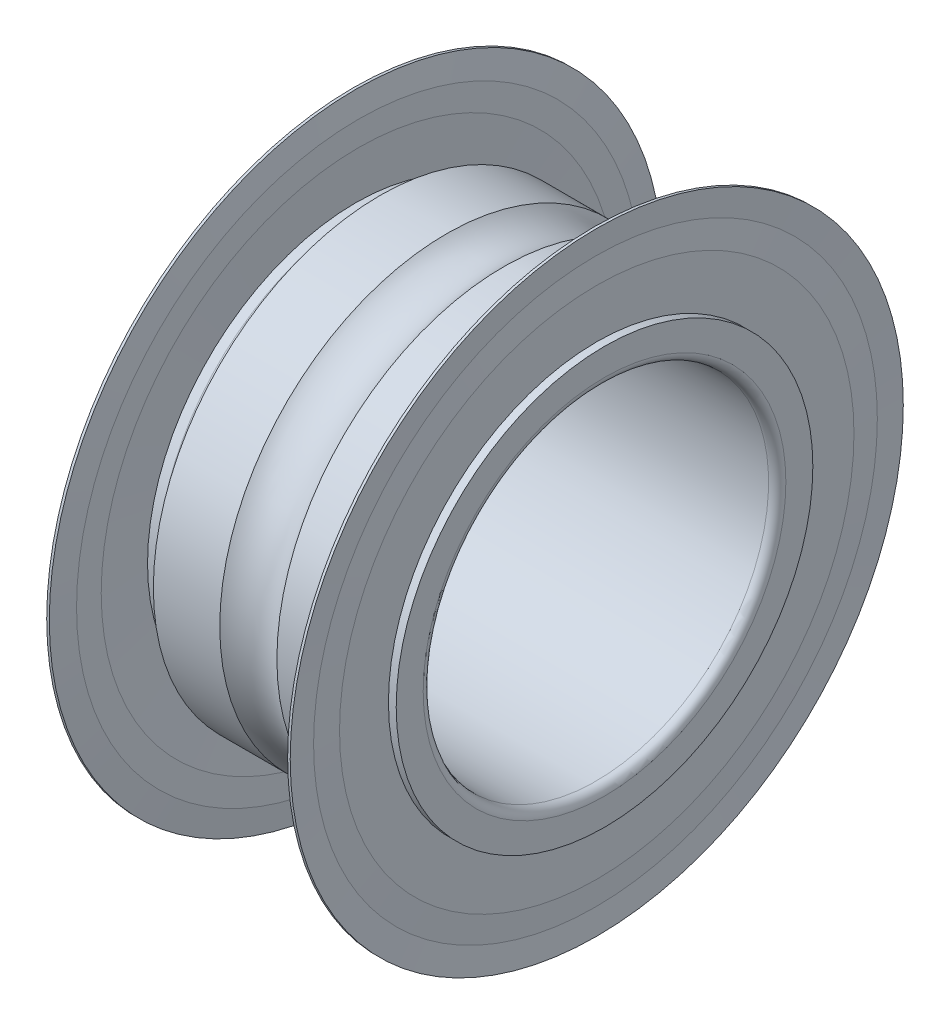
ISO-10303-21;
HEADER;
FILE_DESCRIPTION(('STEP AP214'),'2;1');
FILE_NAME('part.step','',(''),(''),'','','');
FILE_SCHEMA(('AUTOMOTIVE_DESIGN { 1 0 10303 214 1 1 1 1 }'));
ENDSEC;
DATA;
#1=APPLICATION_CONTEXT('core data for automotive mechanical design processes');
#2=APPLICATION_PROTOCOL_DEFINITION('international standard','automotive_design',2000,#1);
#3=PRODUCT_CONTEXT('',#1,'mechanical');
#4=PRODUCT('Part','Part','',(#3));
#5=PRODUCT_RELATED_PRODUCT_CATEGORY('part','',(#4));
#6=PRODUCT_DEFINITION_FORMATION('','',#4);
#7=PRODUCT_DEFINITION_CONTEXT('part definition',#1,'design');
#8=PRODUCT_DEFINITION('design','',#6,#7);
#9=PRODUCT_DEFINITION_SHAPE('','',#8);
#10=(LENGTH_UNIT() NAMED_UNIT(*) SI_UNIT(.MILLI.,.METRE.));
#11=(NAMED_UNIT(*) PLANE_ANGLE_UNIT() SI_UNIT($,.RADIAN.));
#12=(NAMED_UNIT(*) SI_UNIT($,.STERADIAN.) SOLID_ANGLE_UNIT());
#13=UNCERTAINTY_MEASURE_WITH_UNIT(LENGTH_MEASURE(1.E-05),#10,'distance_accuracy_value','');
#14=(GEOMETRIC_REPRESENTATION_CONTEXT(3) GLOBAL_UNCERTAINTY_ASSIGNED_CONTEXT((#13)) GLOBAL_UNIT_ASSIGNED_CONTEXT((#10,
#11,#12)) REPRESENTATION_CONTEXT('',''));
#15=CARTESIAN_POINT('',(0.,0.,0.));
#16=DIRECTION('',(0.,0.,1.));
#17=DIRECTION('',(1.,0.,0.));
#18=AXIS2_PLACEMENT_3D('',#15,#16,#17);
#19=CARTESIAN_POINT('',(0.,-4.825,-4.825));
#20=DIRECTION('',(-1.,0.,0.));
#21=DIRECTION('',(0.,0.,1.));
#22=AXIS2_PLACEMENT_3D('',#19,#20,#21);
#23=PLANE('',#22);
#24=CARTESIAN_POINT('',(0.,0.,0.));
#25=DIRECTION('',(-1.,0.,0.));
#26=DIRECTION('',(0.,0.,-1.));
#27=AXIS2_PLACEMENT_3D('',#24,#25,#26);
#28=CIRCLE('',#27,4.825);
#29=CARTESIAN_POINT('',(0.,0.,-4.825));
#30=VERTEX_POINT('',#29);
#31=EDGE_CURVE('E109',#30,#30,#28,.F.);
#32=ORIENTED_EDGE('',*,*,#31,.F.);
#33=EDGE_LOOP('',(#32));
#34=FACE_BOUND('',#33,.T.);
#35=CARTESIAN_POINT('',(0.,0.,0.));
#36=DIRECTION('',(1.,0.,0.));
#37=DIRECTION('',(0.,0.,1.));
#38=AXIS2_PLACEMENT_3D('',#35,#36,#37);
#39=CIRCLE('',#38,4.2);
#40=CARTESIAN_POINT('',(0.,0.,4.2));
#41=VERTEX_POINT('',#40);
#42=EDGE_CURVE('E106',#41,#41,#39,.T.);
#43=ORIENTED_EDGE('',*,*,#42,.T.);
#44=EDGE_LOOP('',(#43));
#45=FACE_BOUND('',#44,.T.);
#46=ADVANCED_FACE('F14',(#34,#45),#23,.T.);
#47=CARTESIAN_POINT('',(6.,-4.8249997657901,4.82500037109325));
#48=DIRECTION('',(1.,0.,0.));
#49=DIRECTION('',(0.,0.,-1.));
#50=AXIS2_PLACEMENT_3D('',#47,#48,#49);
#51=PLANE('',#50);
#52=CARTESIAN_POINT('',(6.,0.,0.));
#53=DIRECTION('',(1.,0.,0.));
#54=DIRECTION('',(0.,-1.42310903832655E-07,0.99999999999999));
#55=AXIS2_PLACEMENT_3D('',#52,#53,#54);
#56=CIRCLE('',#55,4.825);
#57=CARTESIAN_POINT('',(6.,-6.86650110992563E-07,4.82499999999995));
#58=VERTEX_POINT('',#57);
#59=EDGE_CURVE('E103',#58,#58,#56,.T.);
#60=ORIENTED_EDGE('',*,*,#59,.T.);
#61=EDGE_LOOP('',(#60));
#62=FACE_BOUND('',#61,.T.);
#63=CARTESIAN_POINT('',(6.,0.,0.));
#64=DIRECTION('',(-1.,0.,0.));
#65=DIRECTION('',(0.,0.,-1.));
#66=AXIS2_PLACEMENT_3D('',#63,#64,#65);
#67=CIRCLE('',#66,4.20000011099115);
#68=CARTESIAN_POINT('',(6.,0.,-4.20000011099115));
#69=VERTEX_POINT('',#68);
#70=EDGE_CURVE('E100',#69,#69,#67,.F.);
#71=ORIENTED_EDGE('',*,*,#70,.F.);
#72=EDGE_LOOP('',(#71));
#73=FACE_BOUND('',#72,.T.);
#74=ADVANCED_FACE('F117',(#62,#73),#51,.T.);
#75=CARTESIAN_POINT('',(0.8,-5.32082048514981,5.25000017536941));
#76=DIRECTION('',(-1.,0.,0.));
#77=DIRECTION('',(0.,1.,0.));
#78=AXIS2_PLACEMENT_3D('',#75,#76,#77);
#79=PLANE('',#78);
#80=CARTESIAN_POINT('',(0.8,0.,0.));
#81=DIRECTION('',(-1.,0.,0.));
#82=DIRECTION('',(0.,0.,-1.));
#83=AXIS2_PLACEMENT_3D('',#80,#81,#82);
#84=CIRCLE('',#83,5.25);
#85=CARTESIAN_POINT('',(0.8,0.,-5.25));
#86=VERTEX_POINT('',#85);
#87=EDGE_CURVE('E97',#86,#86,#84,.T.);
#88=ORIENTED_EDGE('',*,*,#87,.T.);
#89=EDGE_LOOP('',(#88));
#90=FACE_BOUND('',#89,.T.);
#91=CARTESIAN_POINT('',(0.8,0.,0.));
#92=DIRECTION('',(1.,0.,0.));
#93=DIRECTION('',(0.,0.,1.));
#94=AXIS2_PLACEMENT_3D('',#91,#92,#93);
#95=CIRCLE('',#94,5.15833335866041);
#96=CARTESIAN_POINT('',(0.8,0.,5.15833335866041));
#97=VERTEX_POINT('',#96);
#98=EDGE_CURVE('E94',#97,#97,#95,.T.);
#99=ORIENTED_EDGE('',*,*,#98,.T.);
#100=EDGE_LOOP('',(#99));
#101=FACE_BOUND('',#100,.T.);
#102=ADVANCED_FACE('F392',(#90,#101),#79,.T.);
#103=CARTESIAN_POINT('',(5.2,-5.32082048514981,-5.25000017536941));
#104=DIRECTION('',(1.,0.,0.));
#105=DIRECTION('',(0.,1.,0.));
#106=AXIS2_PLACEMENT_3D('',#103,#104,#105);
#107=PLANE('',#106);
#108=CARTESIAN_POINT('',(5.2,0.,0.));
#109=DIRECTION('',(1.,0.,0.));
#110=DIRECTION('',(0.,0.,1.));
#111=AXIS2_PLACEMENT_3D('',#108,#109,#110);
#112=CIRCLE('',#111,5.25);
#113=CARTESIAN_POINT('',(5.2,0.,5.25));
#114=VERTEX_POINT('',#113);
#115=EDGE_CURVE('E91',#114,#114,#112,.T.);
#116=ORIENTED_EDGE('',*,*,#115,.T.);
#117=EDGE_LOOP('',(#116));
#118=FACE_BOUND('',#117,.T.);
#119=CARTESIAN_POINT('',(5.2,0.,0.));
#120=DIRECTION('',(-1.,0.,0.));
#121=DIRECTION('',(0.,0.,-1.));
#122=AXIS2_PLACEMENT_3D('',#119,#120,#121);
#123=CIRCLE('',#122,5.15833336552346);
#124=CARTESIAN_POINT('',(5.2,0.,-5.15833336552346));
#125=VERTEX_POINT('',#124);
#126=EDGE_CURVE('E88',#125,#125,#123,.F.);
#127=ORIENTED_EDGE('',*,*,#126,.F.);
#128=EDGE_LOOP('',(#127));
#129=FACE_BOUND('',#128,.T.);
#130=ADVANCED_FACE('F382',(#118,#129),#107,.T.);
#131=CARTESIAN_POINT('',(0.18,-6.12028247775235,-5.9575));
#132=DIRECTION('',(-1.,0.,0.));
#133=DIRECTION('',(0.,0.,1.));
#134=AXIS2_PLACEMENT_3D('',#131,#132,#133);
#135=PLANE('',#134);
#136=CARTESIAN_POINT('',(0.18,0.,0.));
#137=DIRECTION('',(-1.,0.,0.));
#138=DIRECTION('',(0.,0.,-1.));
#139=AXIS2_PLACEMENT_3D('',#136,#137,#138);
#140=CIRCLE('',#139,5.95750000000004);
#141=CARTESIAN_POINT('',(0.18,0.,-5.95750000000004));
#142=VERTEX_POINT('',#141);
#143=EDGE_CURVE('E85',#142,#142,#140,.F.);
#144=ORIENTED_EDGE('',*,*,#143,.F.);
#145=EDGE_LOOP('',(#144));
#146=FACE_BOUND('',#145,.T.);
#147=CARTESIAN_POINT('',(0.18,0.,0.));
#148=DIRECTION('',(1.,0.,0.));
#149=DIRECTION('',(0.,-1.42053889480427E-07,0.99999999999999));
#150=AXIS2_PLACEMENT_3D('',#147,#148,#149);
#151=CIRCLE('',#150,4.825);
#152=CARTESIAN_POINT('',(0.18,-6.85410016743059E-07,4.82499999999995));
#153=VERTEX_POINT('',#152);
#154=EDGE_CURVE('E82',#153,#153,#151,.F.);
#155=ORIENTED_EDGE('',*,*,#154,.F.);
#156=EDGE_LOOP('',(#155));
#157=FACE_BOUND('',#156,.T.);
#158=ADVANCED_FACE('F372',(#146,#157),#135,.T.);
#159=CARTESIAN_POINT('',(0.3,-6.70714127742983,6.52875));
#160=DIRECTION('',(1.,0.,0.));
#161=DIRECTION('',(0.,0.,-1.));
#162=AXIS2_PLACEMENT_3D('',#159,#160,#161);
#163=PLANE('',#162);
#164=CARTESIAN_POINT('',(0.3,0.,0.));
#165=DIRECTION('',(1.,0.,0.));
#166=DIRECTION('',(0.,-1.16853194638104E-09,1.));
#167=AXIS2_PLACEMENT_3D('',#164,#165,#166);
#168=CIRCLE('',#167,6.52875);
#169=CARTESIAN_POINT('',(0.3,-7.62905294493521E-09,6.52875));
#170=VERTEX_POINT('',#169);
#171=EDGE_CURVE('E79',#170,#170,#168,.T.);
#172=ORIENTED_EDGE('',*,*,#171,.T.);
#173=EDGE_LOOP('',(#172));
#174=FACE_BOUND('',#173,.T.);
#175=CARTESIAN_POINT('',(0.3,0.,0.));
#176=DIRECTION('',(-1.,0.,0.));
#177=DIRECTION('',(0.,0.,-1.));
#178=AXIS2_PLACEMENT_3D('',#175,#176,#177);
#179=CIRCLE('',#178,5.95749999999997);
#180=CARTESIAN_POINT('',(0.3,0.,-5.95749999999997));
#181=VERTEX_POINT('',#180);
#182=EDGE_CURVE('E76',#181,#181,#179,.F.);
#183=ORIENTED_EDGE('',*,*,#182,.F.);
#184=EDGE_LOOP('',(#183));
#185=FACE_BOUND('',#184,.T.);
#186=ADVANCED_FACE('F362',(#174,#185),#163,.T.);
#187=CARTESIAN_POINT('',(5.7,-6.70714128856494,-6.52875));
#188=DIRECTION('',(-1.,0.,0.));
#189=DIRECTION('',(0.,0.,1.));
#190=AXIS2_PLACEMENT_3D('',#187,#188,#189);
#191=PLANE('',#190);
#192=CARTESIAN_POINT('',(5.7,0.,0.));
#193=DIRECTION('',(-1.,0.,0.));
#194=DIRECTION('',(0.,0.,-1.));
#195=AXIS2_PLACEMENT_3D('',#192,#193,#194);
#196=CIRCLE('',#195,6.52875000000004);
#197=CARTESIAN_POINT('',(5.7,0.,-6.52875000000004));
#198=VERTEX_POINT('',#197);
#199=EDGE_CURVE('E73',#198,#198,#196,.F.);
#200=ORIENTED_EDGE('',*,*,#199,.F.);
#201=EDGE_LOOP('',(#200));
#202=FACE_BOUND('',#201,.T.);
#203=CARTESIAN_POINT('',(5.7,0.,0.));
#204=DIRECTION('',(1.,0.,0.));
#205=DIRECTION('',(0.,0.,1.));
#206=AXIS2_PLACEMENT_3D('',#203,#204,#205);
#207=CIRCLE('',#206,5.95749999999998);
#208=CARTESIAN_POINT('',(5.7,0.,5.95749999999998));
#209=VERTEX_POINT('',#208);
#210=EDGE_CURVE('E70',#209,#209,#207,.T.);
#211=ORIENTED_EDGE('',*,*,#210,.T.);
#212=EDGE_LOOP('',(#211));
#213=FACE_BOUND('',#212,.T.);
#214=ADVANCED_FACE('F352',(#202,#213),#191,.T.);
#215=CARTESIAN_POINT('',(5.82,-6.12028247775235,5.9575));
#216=DIRECTION('',(1.,0.,0.));
#217=DIRECTION('',(0.,0.,-1.));
#218=AXIS2_PLACEMENT_3D('',#215,#216,#217);
#219=PLANE('',#218);
#220=CARTESIAN_POINT('',(5.82,0.,0.));
#221=DIRECTION('',(1.,0.,0.));
#222=DIRECTION('',(0.,0.,1.));
#223=AXIS2_PLACEMENT_3D('',#220,#221,#222);
#224=CIRCLE('',#223,5.9575);
#225=CARTESIAN_POINT('',(5.82,0.,5.9575));
#226=VERTEX_POINT('',#225);
#227=EDGE_CURVE('E67',#226,#226,#224,.T.);
#228=ORIENTED_EDGE('',*,*,#227,.T.);
#229=EDGE_LOOP('',(#228));
#230=FACE_BOUND('',#229,.T.);
#231=CARTESIAN_POINT('',(5.82,0.,0.));
#232=DIRECTION('',(-1.,0.,0.));
#233=DIRECTION('',(0.,0.,-1.));
#234=AXIS2_PLACEMENT_3D('',#231,#232,#233);
#235=CIRCLE('',#234,4.825);
#236=CARTESIAN_POINT('',(5.82,0.,-4.825));
#237=VERTEX_POINT('',#236);
#238=EDGE_CURVE('E64',#237,#237,#235,.F.);
#239=ORIENTED_EDGE('',*,*,#238,.F.);
#240=EDGE_LOOP('',(#239));
#241=FACE_BOUND('',#240,.T.);
#242=ADVANCED_FACE('F343',(#230,#241),#219,.T.);
#243=CARTESIAN_POINT('',(50.,0.,0.));
#244=DIRECTION('',(1.,0.,0.));
#245=DIRECTION('',(0.,1.9234093241047E-10,1.));
#246=AXIS2_PLACEMENT_3D('',#243,#244,#245);
#247=CYLINDRICAL_SURFACE('',#246,4.825);
#248=CARTESIAN_POINT('',(5.75947483588622,0.,0.));
#249=DIRECTION('',(-1.,0.,0.));
#250=DIRECTION('',(0.,0.,-1.));
#251=AXIS2_PLACEMENT_3D('',#248,#249,#250);
#252=CIRCLE('',#251,4.825);
#253=CARTESIAN_POINT('',(5.75947483588622,0.,-4.825));
#254=VERTEX_POINT('',#253);
#255=EDGE_CURVE('E61',#254,#254,#252,.T.);
#256=ORIENTED_EDGE('',*,*,#255,.T.);
#257=EDGE_LOOP('',(#256));
#258=FACE_BOUND('',#257,.T.);
#259=CARTESIAN_POINT('',(5.5333333333333,0.,0.));
#260=DIRECTION('',(1.,0.,0.));
#261=DIRECTION('',(0.,0.,1.));
#262=AXIS2_PLACEMENT_3D('',#259,#260,#261);
#263=CIRCLE('',#262,4.825);
#264=CARTESIAN_POINT('',(5.5333333333333,0.,4.825));
#265=VERTEX_POINT('',#264);
#266=EDGE_CURVE('E58',#265,#265,#263,.T.);
#267=ORIENTED_EDGE('',*,*,#266,.T.);
#268=EDGE_LOOP('',(#267));
#269=FACE_BOUND('',#268,.T.);
#270=ADVANCED_FACE('F134',(#258,#269),#247,.T.);
#271=CARTESIAN_POINT('',(50.,0.,0.));
#272=DIRECTION('',(1.,0.,0.));
#273=DIRECTION('',(0.,0.,1.));
#274=AXIS2_PLACEMENT_3D('',#271,#272,#273);
#275=CYLINDRICAL_SURFACE('',#274,4.825);
#276=ORIENTED_EDGE('',*,*,#154,.T.);
#277=EDGE_LOOP('',(#276));
#278=FACE_BOUND('',#277,.T.);
#279=ORIENTED_EDGE('',*,*,#31,.T.);
#280=EDGE_LOOP('',(#279));
#281=FACE_BOUND('',#280,.T.);
#282=ADVANCED_FACE('F113',(#278,#281),#275,.T.);
#283=CARTESIAN_POINT('',(0.200000000000016,0.,0.));
#284=DIRECTION('',(1.,0.,0.));
#285=DIRECTION('',(0.,0.,1.));
#286=AXIS2_PLACEMENT_3D('',#283,#284,#285);
#287=TOROIDAL_SURFACE('',#286,4.2,0.200000000000016);
#288=CARTESIAN_POINT('',(0.2,0.,0.));
#289=DIRECTION('',(1.,0.,0.));
#290=DIRECTION('',(0.,0.,1.));
#291=AXIS2_PLACEMENT_3D('',#288,#289,#290);
#292=CIRCLE('',#291,3.99999999999998);
#293=CARTESIAN_POINT('',(0.2,0.,3.99999999999998));
#294=VERTEX_POINT('',#293);
#295=EDGE_CURVE('E55',#294,#294,#292,.T.);
#296=ORIENTED_EDGE('',*,*,#295,.T.);
#297=EDGE_LOOP('',(#296));
#298=FACE_BOUND('',#297,.T.);
#299=ORIENTED_EDGE('',*,*,#42,.F.);
#300=EDGE_LOOP('',(#299));
#301=FACE_BOUND('',#300,.T.);
#302=ADVANCED_FACE('F121',(#298,#301),#287,.T.);
#303=CARTESIAN_POINT('',(50.,0.,0.));
#304=DIRECTION('',(1.,0.,0.));
#305=DIRECTION('',(0.,0.,1.));
#306=AXIS2_PLACEMENT_3D('',#303,#304,#305);
#307=CYLINDRICAL_SURFACE('',#306,4.);
#308=CARTESIAN_POINT('',(5.8,0.,0.));
#309=DIRECTION('',(1.,0.,0.));
#310=DIRECTION('',(0.,0.,1.));
#311=AXIS2_PLACEMENT_3D('',#308,#309,#310);
#312=CIRCLE('',#311,4.);
#313=CARTESIAN_POINT('',(5.8,0.,4.));
#314=VERTEX_POINT('',#313);
#315=EDGE_CURVE('E52',#314,#314,#312,.T.);
#316=ORIENTED_EDGE('',*,*,#315,.T.);
#317=EDGE_LOOP('',(#316));
#318=FACE_BOUND('',#317,.T.);
#319=ORIENTED_EDGE('',*,*,#295,.F.);
#320=EDGE_LOOP('',(#319));
#321=FACE_BOUND('',#320,.T.);
#322=ADVANCED_FACE('F123',(#318,#321),#307,.F.);
#323=CARTESIAN_POINT('',(5.8,0.,0.));
#324=DIRECTION('',(1.,0.,0.));
#325=DIRECTION('',(0.,0.,1.));
#326=AXIS2_PLACEMENT_3D('',#323,#324,#325);
#327=TOROIDAL_SURFACE('',#326,4.2,0.200000000000031);
#328=ORIENTED_EDGE('',*,*,#70,.T.);
#329=EDGE_LOOP('',(#328));
#330=FACE_BOUND('',#329,.T.);
#331=ORIENTED_EDGE('',*,*,#315,.F.);
#332=EDGE_LOOP('',(#331));
#333=FACE_BOUND('',#332,.T.);
#334=ADVANCED_FACE('F131',(#330,#333),#327,.T.);
#335=CARTESIAN_POINT('',(50.,0.,0.));
#336=DIRECTION('',(1.,0.,0.));
#337=DIRECTION('',(0.,1.9234093241047E-10,1.));
#338=AXIS2_PLACEMENT_3D('',#335,#336,#337);
#339=CYLINDRICAL_SURFACE('',#338,4.825);
#340=CARTESIAN_POINT('',(0.466666666666669,0.,0.));
#341=DIRECTION('',(-1.,0.,0.));
#342=DIRECTION('',(0.,0.,-1.));
#343=AXIS2_PLACEMENT_3D('',#340,#341,#342);
#344=CIRCLE('',#343,4.825);
#345=CARTESIAN_POINT('',(0.466666666666669,0.,-4.825));
#346=VERTEX_POINT('',#345);
#347=EDGE_CURVE('E49',#346,#346,#344,.F.);
#348=ORIENTED_EDGE('',*,*,#347,.F.);
#349=EDGE_LOOP('',(#348));
#350=FACE_BOUND('',#349,.T.);
#351=CARTESIAN_POINT('',(0.240525164113784,0.,0.));
#352=DIRECTION('',(1.,0.,0.));
#353=DIRECTION('',(0.,0.,1.));
#354=AXIS2_PLACEMENT_3D('',#351,#352,#353);
#355=CIRCLE('',#354,4.825);
#356=CARTESIAN_POINT('',(0.240525164113784,0.,4.825));
#357=VERTEX_POINT('',#356);
#358=EDGE_CURVE('E46',#357,#357,#355,.T.);
#359=ORIENTED_EDGE('',*,*,#358,.T.);
#360=EDGE_LOOP('',(#359));
#361=FACE_BOUND('',#360,.T.);
#362=ADVANCED_FACE('F141',(#350,#361),#339,.T.);
#363=CARTESIAN_POINT('',(0.466666666666693,0.,0.));
#364=DIRECTION('',(1.,0.,0.));
#365=DIRECTION('',(0.,1.9234093241047E-10,1.));
#366=AXIS2_PLACEMENT_3D('',#363,#364,#365);
#367=TOROIDAL_SURFACE('',#366,5.15833333333331,0.333333333333308);
#368=ORIENTED_EDGE('',*,*,#98,.F.);
#369=EDGE_LOOP('',(#368));
#370=FACE_BOUND('',#369,.T.);
#371=ORIENTED_EDGE('',*,*,#347,.T.);
#372=EDGE_LOOP('',(#371));
#373=FACE_BOUND('',#372,.T.);
#374=ADVANCED_FACE('F145',(#370,#373),#367,.F.);
#375=CARTESIAN_POINT('',(5.53333333333327,0.,0.));
#376=DIRECTION('',(1.,0.,0.));
#377=DIRECTION('',(0.,1.4187901621366E-07,0.99999999999999));
#378=AXIS2_PLACEMENT_3D('',#375,#376,#377);
#379=TOROIDAL_SURFACE('',#378,5.15833333333327,0.333333333333272);
#380=ORIENTED_EDGE('',*,*,#126,.T.);
#381=EDGE_LOOP('',(#380));
#382=FACE_BOUND('',#381,.T.);
#383=ORIENTED_EDGE('',*,*,#266,.F.);
#384=EDGE_LOOP('',(#383));
#385=FACE_BOUND('',#384,.T.);
#386=ADVANCED_FACE('F149',(#382,#385),#379,.F.);
#387=CARTESIAN_POINT('',(50.,0.,0.));
#388=DIRECTION('',(1.,0.,0.));
#389=DIRECTION('',(0.,0.,1.));
#390=AXIS2_PLACEMENT_3D('',#387,#388,#389);
#391=CYLINDRICAL_SURFACE('',#390,4.825);
#392=ORIENTED_EDGE('',*,*,#59,.F.);
#393=EDGE_LOOP('',(#392));
#394=FACE_BOUND('',#393,.T.);
#395=ORIENTED_EDGE('',*,*,#238,.T.);
#396=EDGE_LOOP('',(#395));
#397=FACE_BOUND('',#396,.T.);
#398=ADVANCED_FACE('F153',(#394,#397),#391,.T.);
#399=CARTESIAN_POINT('',(50.,0.,0.));
#400=DIRECTION('',(1.,0.,0.));
#401=DIRECTION('',(0.,0.,1.));
#402=AXIS2_PLACEMENT_3D('',#399,#400,#401);
#403=CYLINDRICAL_SURFACE('',#402,5.25);
#404=CARTESIAN_POINT('',(3.6614378277661,0.,0.));
#405=DIRECTION('',(1.,0.,0.));
#406=DIRECTION('',(0.,0.,1.));
#407=AXIS2_PLACEMENT_3D('',#404,#405,#406);
#408=CIRCLE('',#407,5.25);
#409=CARTESIAN_POINT('',(3.6614378277661,0.,5.25));
#410=VERTEX_POINT('',#409);
#411=EDGE_CURVE('E43',#410,#410,#408,.T.);
#412=ORIENTED_EDGE('',*,*,#411,.T.);
#413=EDGE_LOOP('',(#412));
#414=FACE_BOUND('',#413,.T.);
#415=ORIENTED_EDGE('',*,*,#115,.F.);
#416=EDGE_LOOP('',(#415));
#417=FACE_BOUND('',#416,.T.);
#418=ADVANCED_FACE('F157',(#414,#417),#403,.T.);
#419=CARTESIAN_POINT('',(3.,0.,0.));
#420=DIRECTION('',(1.,0.,0.));
#421=DIRECTION('',(0.,0.,1.));
#422=AXIS2_PLACEMENT_3D('',#419,#420,#421);
#423=TOROIDAL_SURFACE('',#422,5.99999999999987,0.999999999999873);
#424=ORIENTED_EDGE('',*,*,#411,.F.);
#425=EDGE_LOOP('',(#424));
#426=FACE_BOUND('',#425,.T.);
#427=CARTESIAN_POINT('',(2.3385621722339,0.,0.));
#428=DIRECTION('',(1.,0.,0.));
#429=DIRECTION('',(0.,0.,1.));
#430=AXIS2_PLACEMENT_3D('',#427,#428,#429);
#431=CIRCLE('',#430,5.25);
#432=CARTESIAN_POINT('',(2.3385621722339,0.,5.25));
#433=VERTEX_POINT('',#432);
#434=EDGE_CURVE('E40',#433,#433,#431,.T.);
#435=ORIENTED_EDGE('',*,*,#434,.T.);
#436=EDGE_LOOP('',(#435));
#437=FACE_BOUND('',#436,.T.);
#438=ADVANCED_FACE('F161',(#426,#437),#423,.F.);
#439=CARTESIAN_POINT('',(50.,0.,0.));
#440=DIRECTION('',(1.,0.,0.));
#441=DIRECTION('',(0.,1.420367278352E-07,0.99999999999999));
#442=AXIS2_PLACEMENT_3D('',#439,#440,#441);
#443=CYLINDRICAL_SURFACE('',#442,5.25);
#444=ORIENTED_EDGE('',*,*,#87,.F.);
#445=EDGE_LOOP('',(#444));
#446=FACE_BOUND('',#445,.T.);
#447=ORIENTED_EDGE('',*,*,#434,.F.);
#448=EDGE_LOOP('',(#447));
#449=FACE_BOUND('',#448,.T.);
#450=ADVANCED_FACE('F165',(#446,#449),#443,.T.);
#451=CARTESIAN_POINT('',(0.300000000000002,0.,0.));
#452=DIRECTION('',(1.,0.,0.));
#453=DIRECTION('',(0.,0.,1.));
#454=AXIS2_PLACEMENT_3D('',#451,#452,#453);
#455=CONICAL_SURFACE('',#454,5.9575,1.51832811530404);
#456=ORIENTED_EDGE('',*,*,#182,.T.);
#457=EDGE_LOOP('',(#456));
#458=FACE_BOUND('',#457,.T.);
#459=ORIENTED_EDGE('',*,*,#358,.F.);
#460=EDGE_LOOP('',(#459));
#461=FACE_BOUND('',#460,.T.);
#462=ADVANCED_FACE('F169',(#458,#461),#455,.F.);
#463=CARTESIAN_POINT('',(50.,0.,0.));
#464=DIRECTION('',(1.,0.,0.));
#465=DIRECTION('',(0.,0.,1.));
#466=AXIS2_PLACEMENT_3D('',#463,#464,#465);
#467=CYLINDRICAL_SURFACE('',#466,7.1);
#468=CARTESIAN_POINT('',(0.18,0.,0.));
#469=DIRECTION('',(1.,0.,0.));
#470=DIRECTION('',(0.,0.,1.));
#471=AXIS2_PLACEMENT_3D('',#468,#469,#470);
#472=CIRCLE('',#471,7.1);
#473=CARTESIAN_POINT('',(0.18,0.,7.1));
#474=VERTEX_POINT('',#473);
#475=EDGE_CURVE('E37',#474,#474,#472,.T.);
#476=ORIENTED_EDGE('',*,*,#475,.T.);
#477=EDGE_LOOP('',(#476));
#478=FACE_BOUND('',#477,.T.);
#479=CARTESIAN_POINT('',(0.239999999999995,0.,0.));
#480=DIRECTION('',(-1.,0.,0.));
#481=DIRECTION('',(0.,0.,-1.));
#482=AXIS2_PLACEMENT_3D('',#479,#480,#481);
#483=CIRCLE('',#482,7.1);
#484=CARTESIAN_POINT('',(0.239999999999995,0.,-7.1));
#485=VERTEX_POINT('',#484);
#486=EDGE_CURVE('E34',#485,#485,#483,.F.);
#487=ORIENTED_EDGE('',*,*,#486,.F.);
#488=EDGE_LOOP('',(#487));
#489=FACE_BOUND('',#488,.T.);
#490=ADVANCED_FACE('F173',(#478,#489),#467,.T.);
#491=CARTESIAN_POINT('',(0.18,0.,0.));
#492=DIRECTION('',(-1.,0.,0.));
#493=DIRECTION('',(0.,0.,-1.));
#494=AXIS2_PLACEMENT_3D('',#491,#492,#493);
#495=CONICAL_SURFACE('',#494,7.1,1.51832811530404);
#496=ORIENTED_EDGE('',*,*,#475,.F.);
#497=EDGE_LOOP('',(#496));
#498=FACE_BOUND('',#497,.T.);
#499=CARTESIAN_POINT('',(0.210000000000002,0.,0.));
#500=DIRECTION('',(1.,0.,0.));
#501=DIRECTION('',(0.,0.,1.));
#502=AXIS2_PLACEMENT_3D('',#499,#500,#501);
#503=CIRCLE('',#502,6.52875);
#504=CARTESIAN_POINT('',(0.210000000000002,0.,6.52875));
#505=VERTEX_POINT('',#504);
#506=EDGE_CURVE('E29',#505,#505,#503,.T.);
#507=ORIENTED_EDGE('',*,*,#506,.T.);
#508=EDGE_LOOP('',(#507));
#509=FACE_BOUND('',#508,.T.);
#510=ADVANCED_FACE('F177',(#498,#509),#495,.F.);
#511=CARTESIAN_POINT('',(0.21,0.,0.));
#512=DIRECTION('',(1.,0.,0.));
#513=DIRECTION('',(0.,0.,1.));
#514=AXIS2_PLACEMENT_3D('',#511,#512,#513);
#515=CONICAL_SURFACE('',#514,6.52875,1.51832811530404);
#516=ORIENTED_EDGE('',*,*,#143,.T.);
#517=EDGE_LOOP('',(#516));
#518=FACE_BOUND('',#517,.T.);
#519=ORIENTED_EDGE('',*,*,#506,.F.);
#520=EDGE_LOOP('',(#519));
#521=FACE_BOUND('',#520,.T.);
#522=ADVANCED_FACE('F181',(#518,#521),#515,.T.);
#523=CARTESIAN_POINT('',(0.239999999999995,0.,0.));
#524=DIRECTION('',(-1.,0.,0.));
#525=DIRECTION('',(0.,0.,-1.));
#526=AXIS2_PLACEMENT_3D('',#523,#524,#525);
#527=CONICAL_SURFACE('',#526,7.1,1.46614720444071);
#528=ORIENTED_EDGE('',*,*,#486,.T.);
#529=EDGE_LOOP('',(#528));
#530=FACE_BOUND('',#529,.T.);
#531=ORIENTED_EDGE('',*,*,#171,.F.);
#532=EDGE_LOOP('',(#531));
#533=FACE_BOUND('',#532,.T.);
#534=ADVANCED_FACE('F185',(#530,#533),#527,.T.);
#535=CARTESIAN_POINT('',(5.7,0.,0.));
#536=DIRECTION('',(-1.,0.,0.));
#537=DIRECTION('',(0.,0.,-1.));
#538=AXIS2_PLACEMENT_3D('',#535,#536,#537);
#539=CONICAL_SURFACE('',#538,5.9575,1.51832811530404);
#540=ORIENTED_EDGE('',*,*,#255,.F.);
#541=EDGE_LOOP('',(#540));
#542=FACE_BOUND('',#541,.T.);
#543=ORIENTED_EDGE('',*,*,#210,.F.);
#544=EDGE_LOOP('',(#543));
#545=FACE_BOUND('',#544,.T.);
#546=ADVANCED_FACE('F189',(#542,#545),#539,.F.);
#547=CARTESIAN_POINT('',(5.76,0.,0.));
#548=DIRECTION('',(1.,0.,0.));
#549=DIRECTION('',(0.,1.92334715161532E-10,1.));
#550=AXIS2_PLACEMENT_3D('',#547,#548,#549);
#551=CONICAL_SURFACE('',#550,7.1,1.46614720444071);
#552=ORIENTED_EDGE('',*,*,#199,.T.);
#553=EDGE_LOOP('',(#552));
#554=FACE_BOUND('',#553,.T.);
#555=CARTESIAN_POINT('',(5.76,0.,0.));
#556=DIRECTION('',(-1.,0.,0.));
#557=DIRECTION('',(0.,0.,-1.));
#558=AXIS2_PLACEMENT_3D('',#555,#556,#557);
#559=CIRCLE('',#558,7.1);
#560=CARTESIAN_POINT('',(5.76,0.,-7.1));
#561=VERTEX_POINT('',#560);
#562=EDGE_CURVE('E25',#561,#561,#559,.F.);
#563=ORIENTED_EDGE('',*,*,#562,.F.);
#564=EDGE_LOOP('',(#563));
#565=FACE_BOUND('',#564,.T.);
#566=ADVANCED_FACE('F193',(#554,#565),#551,.T.);
#567=CARTESIAN_POINT('',(5.79,0.,0.));
#568=DIRECTION('',(-1.,0.,0.));
#569=DIRECTION('',(0.,0.,-1.));
#570=AXIS2_PLACEMENT_3D('',#567,#568,#569);
#571=CONICAL_SURFACE('',#570,6.52874999999999,1.51832811530405);
#572=ORIENTED_EDGE('',*,*,#227,.F.);
#573=EDGE_LOOP('',(#572));
#574=FACE_BOUND('',#573,.T.);
#575=CARTESIAN_POINT('',(5.79,0.,0.));
#576=DIRECTION('',(1.,0.,0.));
#577=DIRECTION('',(0.,0.,1.));
#578=AXIS2_PLACEMENT_3D('',#575,#576,#577);
#579=CIRCLE('',#578,6.52874999999999);
#580=CARTESIAN_POINT('',(5.79,0.,6.52874999999999));
#581=VERTEX_POINT('',#580);
#582=EDGE_CURVE('E21',#581,#581,#579,.T.);
#583=ORIENTED_EDGE('',*,*,#582,.T.);
#584=EDGE_LOOP('',(#583));
#585=FACE_BOUND('',#584,.T.);
#586=ADVANCED_FACE('F197',(#574,#585),#571,.T.);
#587=CARTESIAN_POINT('',(5.82,0.,0.));
#588=DIRECTION('',(1.,0.,0.));
#589=DIRECTION('',(0.,0.,1.));
#590=AXIS2_PLACEMENT_3D('',#587,#588,#589);
#591=CONICAL_SURFACE('',#590,7.10000000000001,1.51832811530405);
#592=CARTESIAN_POINT('',(5.82,0.,0.));
#593=DIRECTION('',(1.,0.,0.));
#594=DIRECTION('',(0.,0.,1.));
#595=AXIS2_PLACEMENT_3D('',#592,#593,#594);
#596=CIRCLE('',#595,7.10000000000001);
#597=CARTESIAN_POINT('',(5.82,0.,7.10000000000001));
#598=VERTEX_POINT('',#597);
#599=EDGE_CURVE('E10',#598,#598,#596,.T.);
#600=ORIENTED_EDGE('',*,*,#599,.T.);
#601=EDGE_LOOP('',(#600));
#602=FACE_BOUND('',#601,.T.);
#603=ORIENTED_EDGE('',*,*,#582,.F.);
#604=EDGE_LOOP('',(#603));
#605=FACE_BOUND('',#604,.T.);
#606=ADVANCED_FACE('F200',(#602,#605),#591,.F.);
#607=CARTESIAN_POINT('',(50.,0.,0.));
#608=DIRECTION('',(1.,0.,0.));
#609=DIRECTION('',(0.,7.69338937341299E-10,1.));
#610=AXIS2_PLACEMENT_3D('',#607,#608,#609);
#611=CYLINDRICAL_SURFACE('',#610,7.1);
#612=ORIENTED_EDGE('',*,*,#562,.T.);
#613=EDGE_LOOP('',(#612));
#614=FACE_BOUND('',#613,.T.);
#615=ORIENTED_EDGE('',*,*,#599,.F.);
#616=EDGE_LOOP('',(#615));
#617=FACE_BOUND('',#616,.T.);
#618=ADVANCED_FACE('F16',(#614,#617),#611,.T.);
#619=CLOSED_SHELL('',(#46,#74,#102,#130,#158,#186,#214,#242,#270,#282,#302,#322,#334,#362,#374,
#386,#398,#418,#438,#450,#462,#490,#510,#522,#534,#546,#566,#586,#606,#618));
#620=MANIFOLD_SOLID_BREP('B1',#619);
#621=ADVANCED_BREP_SHAPE_REPRESENTATION('',(#18,#620),#14);
#622=SHAPE_DEFINITION_REPRESENTATION(#9,#621);
ENDSEC;
END-ISO-10303-21;
